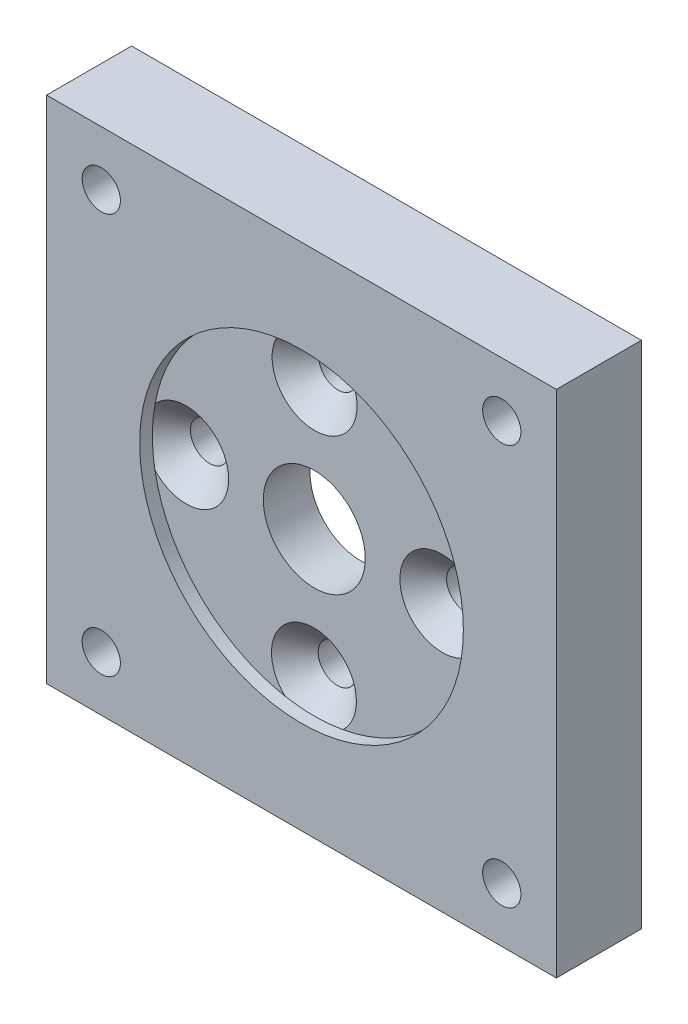
ISO-10303-21;
HEADER;
FILE_DESCRIPTION(('STEP AP214'),'2;1');
FILE_NAME('part.step','',(''),(''),'','','');
FILE_SCHEMA(('AUTOMOTIVE_DESIGN { 1 0 10303 214 1 1 1 1 }'));
ENDSEC;
DATA;
#1=APPLICATION_CONTEXT('core data for automotive mechanical design processes');
#2=APPLICATION_PROTOCOL_DEFINITION('international standard','automotive_design',2000,#1);
#3=PRODUCT_CONTEXT('',#1,'mechanical');
#4=PRODUCT('Part','Part','',(#3));
#5=PRODUCT_RELATED_PRODUCT_CATEGORY('part','',(#4));
#6=PRODUCT_DEFINITION_FORMATION('','',#4);
#7=PRODUCT_DEFINITION_CONTEXT('part definition',#1,'design');
#8=PRODUCT_DEFINITION('design','',#6,#7);
#9=PRODUCT_DEFINITION_SHAPE('','',#8);
#10=(LENGTH_UNIT() NAMED_UNIT(*) SI_UNIT(.MILLI.,.METRE.));
#11=(NAMED_UNIT(*) PLANE_ANGLE_UNIT() SI_UNIT($,.RADIAN.));
#12=(NAMED_UNIT(*) SI_UNIT($,.STERADIAN.) SOLID_ANGLE_UNIT());
#13=UNCERTAINTY_MEASURE_WITH_UNIT(LENGTH_MEASURE(1.E-05),#10,'distance_accuracy_value','');
#14=(GEOMETRIC_REPRESENTATION_CONTEXT(3) GLOBAL_UNCERTAINTY_ASSIGNED_CONTEXT((#13)) GLOBAL_UNIT_ASSIGNED_CONTEXT((#10,
#11,#12)) REPRESENTATION_CONTEXT('',''));
#15=CARTESIAN_POINT('',(0.,0.,0.));
#16=DIRECTION('',(0.,0.,1.));
#17=DIRECTION('',(1.,0.,0.));
#18=AXIS2_PLACEMENT_3D('',#15,#16,#17);
#19=CARTESIAN_POINT('',(0.,0.,0.));
#20=DIRECTION('',(0.,0.,1.));
#21=DIRECTION('',(1.,0.,0.));
#22=AXIS2_PLACEMENT_3D('',#19,#20,#21);
#23=CYLINDRICAL_SURFACE('',#22,6.);
#24=CARTESIAN_POINT('',(0.,0.,8.5));
#25=DIRECTION('',(0.,0.,1.));
#26=DIRECTION('',(1.,0.,0.));
#27=AXIS2_PLACEMENT_3D('',#24,#25,#26);
#28=CIRCLE('',#27,6.);
#29=CARTESIAN_POINT('',(6.,0.,8.5));
#30=VERTEX_POINT('',#29);
#31=EDGE_CURVE('E136',#30,#30,#28,.F.);
#32=ORIENTED_EDGE('',*,*,#31,.F.);
#33=EDGE_LOOP('',(#32));
#34=FACE_BOUND('',#33,.T.);
#35=CARTESIAN_POINT('',(0.,0.,3.));
#36=DIRECTION('',(0.,0.,-1.));
#37=DIRECTION('',(-1.,0.,0.));
#38=AXIS2_PLACEMENT_3D('',#35,#36,#37);
#39=CIRCLE('',#38,6.);
#40=CARTESIAN_POINT('',(-6.,0.,3.));
#41=VERTEX_POINT('',#40);
#42=EDGE_CURVE('E125',#41,#41,#39,.F.);
#43=ORIENTED_EDGE('',*,*,#42,.F.);
#44=EDGE_LOOP('',(#43));
#45=FACE_BOUND('',#44,.T.);
#46=ADVANCED_FACE('F38',(#34,#45),#23,.F.);
#47=CARTESIAN_POINT('',(-0.0375234668427253,-15.0751884434007,8.5));
#48=DIRECTION('',(0.,0.,1.));
#49=DIRECTION('',(1.,0.,0.));
#50=AXIS2_PLACEMENT_3D('',#47,#48,#49);
#51=CYLINDRICAL_SURFACE('',#50,2.24999999999999);
#52=CARTESIAN_POINT('',(-0.0375234668427253,-15.0751884434007,5.75));
#53=DIRECTION('',(0.,0.,1.));
#54=DIRECTION('',(1.,0.,0.));
#55=AXIS2_PLACEMENT_3D('',#52,#53,#54);
#56=CIRCLE('',#55,2.25);
#57=CARTESIAN_POINT('',(2.21247653315727,-15.0751884434007,5.75));
#58=VERTEX_POINT('',#57);
#59=EDGE_CURVE('E170',#58,#58,#56,.T.);
#60=ORIENTED_EDGE('',*,*,#59,.T.);
#61=EDGE_LOOP('',(#60));
#62=FACE_BOUND('',#61,.T.);
#63=CARTESIAN_POINT('',(-0.0375234668427253,-15.0751884434007,3.));
#64=DIRECTION('',(0.,0.,-1.));
#65=DIRECTION('',(-1.,0.,0.));
#66=AXIS2_PLACEMENT_3D('',#63,#64,#65);
#67=CIRCLE('',#66,2.24999999999999);
#68=CARTESIAN_POINT('',(-2.28752346684272,-15.0751884434007,3.));
#69=VERTEX_POINT('',#68);
#70=EDGE_CURVE('E368',#69,#69,#67,.F.);
#71=ORIENTED_EDGE('',*,*,#70,.F.);
#72=EDGE_LOOP('',(#71));
#73=FACE_BOUND('',#72,.T.);
#74=ADVANCED_FACE('F257',(#62,#73),#51,.F.);
#75=CARTESIAN_POINT('',(0.0375234668427323,15.0751884434007,8.5));
#76=DIRECTION('',(0.,0.,1.));
#77=DIRECTION('',(1.,0.,0.));
#78=AXIS2_PLACEMENT_3D('',#75,#76,#77);
#79=CYLINDRICAL_SURFACE('',#78,2.24999999999999);
#80=CARTESIAN_POINT('',(0.0375234668427323,15.0751884434007,5.75));
#81=DIRECTION('',(0.,0.,1.));
#82=DIRECTION('',(1.,0.,0.));
#83=AXIS2_PLACEMENT_3D('',#80,#81,#82);
#84=CIRCLE('',#83,2.25);
#85=CARTESIAN_POINT('',(2.28752346684273,15.0751884434007,5.75));
#86=VERTEX_POINT('',#85);
#87=EDGE_CURVE('E161',#86,#86,#84,.T.);
#88=ORIENTED_EDGE('',*,*,#87,.T.);
#89=EDGE_LOOP('',(#88));
#90=FACE_BOUND('',#89,.T.);
#91=CARTESIAN_POINT('',(0.0375234668427323,15.0751884434007,3.));
#92=DIRECTION('',(0.,0.,-1.));
#93=DIRECTION('',(-1.,0.,0.));
#94=AXIS2_PLACEMENT_3D('',#91,#92,#93);
#95=CIRCLE('',#94,2.24999999999999);
#96=CARTESIAN_POINT('',(-2.21247653315726,15.0751884434007,3.));
#97=VERTEX_POINT('',#96);
#98=EDGE_CURVE('E364',#97,#97,#95,.F.);
#99=ORIENTED_EDGE('',*,*,#98,.F.);
#100=EDGE_LOOP('',(#99));
#101=FACE_BOUND('',#100,.T.);
#102=ADVANCED_FACE('F263',(#90,#101),#79,.F.);
#103=CARTESIAN_POINT('',(15.0751884434007,-0.0375234668427288,8.5));
#104=DIRECTION('',(0.,0.,1.));
#105=DIRECTION('',(1.,0.,0.));
#106=AXIS2_PLACEMENT_3D('',#103,#104,#105);
#107=CYLINDRICAL_SURFACE('',#106,2.24999999999999);
#108=CARTESIAN_POINT('',(15.0751884434007,-0.0375234668427288,5.75));
#109=DIRECTION('',(0.,0.,1.));
#110=DIRECTION('',(1.,0.,0.));
#111=AXIS2_PLACEMENT_3D('',#108,#109,#110);
#112=CIRCLE('',#111,2.25);
#113=CARTESIAN_POINT('',(17.3251884434007,-0.0375234668427288,5.75));
#114=VERTEX_POINT('',#113);
#115=EDGE_CURVE('E158',#114,#114,#112,.T.);
#116=ORIENTED_EDGE('',*,*,#115,.T.);
#117=EDGE_LOOP('',(#116));
#118=FACE_BOUND('',#117,.T.);
#119=CARTESIAN_POINT('',(15.0751884434007,-0.0375234668427288,3.));
#120=DIRECTION('',(0.,0.,-1.));
#121=DIRECTION('',(-1.,0.,0.));
#122=AXIS2_PLACEMENT_3D('',#119,#120,#121);
#123=CIRCLE('',#122,2.24999999999999);
#124=CARTESIAN_POINT('',(12.8251884434007,-0.0375234668427288,3.));
#125=VERTEX_POINT('',#124);
#126=EDGE_CURVE('E360',#125,#125,#123,.F.);
#127=ORIENTED_EDGE('',*,*,#126,.F.);
#128=EDGE_LOOP('',(#127));
#129=FACE_BOUND('',#128,.T.);
#130=ADVANCED_FACE('F316',(#118,#129),#107,.F.);
#131=CARTESIAN_POINT('',(-15.0751884434007,0.0375234668427288,8.5));
#132=DIRECTION('',(0.,0.,1.));
#133=DIRECTION('',(1.,0.,0.));
#134=AXIS2_PLACEMENT_3D('',#131,#132,#133);
#135=CYLINDRICAL_SURFACE('',#134,2.24999999999999);
#136=CARTESIAN_POINT('',(-15.0751884434007,0.0375234668427288,5.75));
#137=DIRECTION('',(0.,0.,1.));
#138=DIRECTION('',(1.,0.,0.));
#139=AXIS2_PLACEMENT_3D('',#136,#137,#138);
#140=CIRCLE('',#139,2.25);
#141=CARTESIAN_POINT('',(-12.8251884434007,0.0375234668427288,5.75));
#142=VERTEX_POINT('',#141);
#143=EDGE_CURVE('E117',#142,#142,#140,.T.);
#144=ORIENTED_EDGE('',*,*,#143,.T.);
#145=EDGE_LOOP('',(#144));
#146=FACE_BOUND('',#145,.T.);
#147=CARTESIAN_POINT('',(-15.0751884434007,0.0375234668427288,3.));
#148=DIRECTION('',(0.,0.,-1.));
#149=DIRECTION('',(-1.,0.,0.));
#150=AXIS2_PLACEMENT_3D('',#147,#148,#149);
#151=CIRCLE('',#150,2.24999999999999);
#152=CARTESIAN_POINT('',(-17.3251884434007,0.0375234668427288,3.));
#153=VERTEX_POINT('',#152);
#154=EDGE_CURVE('E42',#153,#153,#151,.F.);
#155=ORIENTED_EDGE('',*,*,#154,.F.);
#156=EDGE_LOOP('',(#155));
#157=FACE_BOUND('',#156,.T.);
#158=ADVANCED_FACE('F328',(#146,#157),#135,.F.);
#159=CARTESIAN_POINT('',(30.,-30.,10.));
#160=DIRECTION('',(-1.,0.,0.));
#161=DIRECTION('',(0.,0.,1.));
#162=AXIS2_PLACEMENT_3D('',#159,#160,#161);
#163=PLANE('',#162);
#164=DIRECTION('',(0.,1.,0.));
#165=VECTOR('',#164,1.);
#166=CARTESIAN_POINT('',(30.,-30.,0.));
#167=LINE('',#166,#165);
#168=CARTESIAN_POINT('',(30.,-30.,0.));
#169=VERTEX_POINT('',#168);
#170=CARTESIAN_POINT('',(30.,30.,0.));
#171=VERTEX_POINT('',#170);
#172=EDGE_CURVE('E141',#169,#171,#167,.T.);
#173=ORIENTED_EDGE('',*,*,#172,.T.);
#174=DIRECTION('',(0.,0.,-1.));
#175=VECTOR('',#174,1.);
#176=CARTESIAN_POINT('',(30.,30.,10.));
#177=LINE('',#176,#175);
#178=CARTESIAN_POINT('',(30.,30.,10.));
#179=VERTEX_POINT('',#178);
#180=EDGE_CURVE('E11',#179,#171,#177,.T.);
#181=ORIENTED_EDGE('',*,*,#180,.F.);
#182=DIRECTION('',(0.,1.,0.));
#183=VECTOR('',#182,1.);
#184=CARTESIAN_POINT('',(30.,-30.,10.));
#185=LINE('',#184,#183);
#186=CARTESIAN_POINT('',(30.,-30.,10.));
#187=VERTEX_POINT('',#186);
#188=EDGE_CURVE('E209',#187,#179,#185,.T.);
#189=ORIENTED_EDGE('',*,*,#188,.F.);
#190=DIRECTION('',(0.,0.,-1.));
#191=VECTOR('',#190,1.);
#192=CARTESIAN_POINT('',(30.,-30.,10.));
#193=LINE('',#192,#191);
#194=EDGE_CURVE('E232',#187,#169,#193,.T.);
#195=ORIENTED_EDGE('',*,*,#194,.T.);
#196=EDGE_LOOP('',(#173,#181,#189,#195));
#197=FACE_BOUND('',#196,.T.);
#198=ADVANCED_FACE('F40',(#197),#163,.F.);
#199=CARTESIAN_POINT('',(-30.,30.,10.));
#200=DIRECTION('',(0.,-1.,0.));
#201=DIRECTION('',(0.,0.,-1.));
#202=AXIS2_PLACEMENT_3D('',#199,#200,#201);
#203=PLANE('',#202);
#204=DIRECTION('',(-1.,0.,0.));
#205=VECTOR('',#204,1.);
#206=CARTESIAN_POINT('',(-30.,30.,0.));
#207=LINE('',#206,#205);
#208=CARTESIAN_POINT('',(-30.,30.,0.));
#209=VERTEX_POINT('',#208);
#210=EDGE_CURVE('E224',#171,#209,#207,.T.);
#211=ORIENTED_EDGE('',*,*,#210,.T.);
#212=DIRECTION('',(0.,0.,-1.));
#213=VECTOR('',#212,1.);
#214=CARTESIAN_POINT('',(-30.,30.,10.));
#215=LINE('',#214,#213);
#216=CARTESIAN_POINT('',(-30.,30.,10.));
#217=VERTEX_POINT('',#216);
#218=EDGE_CURVE('E47',#217,#209,#215,.T.);
#219=ORIENTED_EDGE('',*,*,#218,.F.);
#220=DIRECTION('',(-1.,0.,0.));
#221=VECTOR('',#220,1.);
#222=CARTESIAN_POINT('',(-30.,30.,10.));
#223=LINE('',#222,#221);
#224=EDGE_CURVE('E211',#179,#217,#223,.T.);
#225=ORIENTED_EDGE('',*,*,#224,.F.);
#226=ORIENTED_EDGE('',*,*,#180,.T.);
#227=EDGE_LOOP('',(#211,#219,#225,#226));
#228=FACE_BOUND('',#227,.T.);
#229=ADVANCED_FACE('F223',(#228),#203,.F.);
#230=CARTESIAN_POINT('',(-30.,-30.,10.));
#231=DIRECTION('',(1.,0.,0.));
#232=DIRECTION('',(0.,0.,-1.));
#233=AXIS2_PLACEMENT_3D('',#230,#231,#232);
#234=PLANE('',#233);
#235=DIRECTION('',(0.,-1.,0.));
#236=VECTOR('',#235,1.);
#237=CARTESIAN_POINT('',(-30.,-30.,0.));
#238=LINE('',#237,#236);
#239=CARTESIAN_POINT('',(-30.,-30.,0.));
#240=VERTEX_POINT('',#239);
#241=EDGE_CURVE('E235',#209,#240,#238,.T.);
#242=ORIENTED_EDGE('',*,*,#241,.T.);
#243=DIRECTION('',(0.,0.,-1.));
#244=VECTOR('',#243,1.);
#245=CARTESIAN_POINT('',(-30.,-30.,10.));
#246=LINE('',#245,#244);
#247=CARTESIAN_POINT('',(-30.,-30.,10.));
#248=VERTEX_POINT('',#247);
#249=EDGE_CURVE('E239',#248,#240,#246,.T.);
#250=ORIENTED_EDGE('',*,*,#249,.F.);
#251=DIRECTION('',(0.,-1.,0.));
#252=VECTOR('',#251,1.);
#253=CARTESIAN_POINT('',(-30.,-30.,10.));
#254=LINE('',#253,#252);
#255=EDGE_CURVE('E227',#217,#248,#254,.T.);
#256=ORIENTED_EDGE('',*,*,#255,.F.);
#257=ORIENTED_EDGE('',*,*,#218,.T.);
#258=EDGE_LOOP('',(#242,#250,#256,#257));
#259=FACE_BOUND('',#258,.T.);
#260=ADVANCED_FACE('F244',(#259),#234,.F.);
#261=CARTESIAN_POINT('',(-30.,-30.,10.));
#262=DIRECTION('',(0.,1.,0.));
#263=DIRECTION('',(0.,0.,1.));
#264=AXIS2_PLACEMENT_3D('',#261,#262,#263);
#265=PLANE('',#264);
#266=DIRECTION('',(1.,0.,0.));
#267=VECTOR('',#266,1.);
#268=CARTESIAN_POINT('',(-30.,-30.,0.));
#269=LINE('',#268,#267);
#270=EDGE_CURVE('E218',#240,#169,#269,.T.);
#271=ORIENTED_EDGE('',*,*,#270,.T.);
#272=ORIENTED_EDGE('',*,*,#194,.F.);
#273=DIRECTION('',(1.,0.,0.));
#274=VECTOR('',#273,1.);
#275=CARTESIAN_POINT('',(-30.,-30.,10.));
#276=LINE('',#275,#274);
#277=EDGE_CURVE('E214',#248,#187,#276,.T.);
#278=ORIENTED_EDGE('',*,*,#277,.F.);
#279=ORIENTED_EDGE('',*,*,#249,.T.);
#280=EDGE_LOOP('',(#271,#272,#278,#279));
#281=FACE_BOUND('',#280,.T.);
#282=ADVANCED_FACE('F202',(#281),#265,.F.);
#283=CARTESIAN_POINT('',(0.,0.,10.));
#284=DIRECTION('',(0.,0.,-1.));
#285=DIRECTION('',(-1.,0.,0.));
#286=AXIS2_PLACEMENT_3D('',#283,#284,#285);
#287=PLANE('',#286);
#288=CARTESIAN_POINT('',(-23.57,-23.57,10.));
#289=DIRECTION('',(0.,0.,1.));
#290=DIRECTION('',(1.,0.,0.));
#291=AXIS2_PLACEMENT_3D('',#288,#289,#290);
#292=CIRCLE('',#291,2.25);
#293=CARTESIAN_POINT('',(-21.32,-23.57,10.));
#294=VERTEX_POINT('',#293);
#295=EDGE_CURVE('E173',#294,#294,#292,.T.);
#296=ORIENTED_EDGE('',*,*,#295,.F.);
#297=EDGE_LOOP('',(#296));
#298=FACE_BOUND('',#297,.T.);
#299=CARTESIAN_POINT('',(23.57,-23.57,10.));
#300=DIRECTION('',(0.,0.,1.));
#301=DIRECTION('',(1.,0.,0.));
#302=AXIS2_PLACEMENT_3D('',#299,#300,#301);
#303=CIRCLE('',#302,2.25);
#304=CARTESIAN_POINT('',(25.82,-23.57,10.));
#305=VERTEX_POINT('',#304);
#306=EDGE_CURVE('E184',#305,#305,#303,.T.);
#307=ORIENTED_EDGE('',*,*,#306,.F.);
#308=EDGE_LOOP('',(#307));
#309=FACE_BOUND('',#308,.T.);
#310=CARTESIAN_POINT('',(23.57,23.57,10.));
#311=DIRECTION('',(0.,0.,1.));
#312=DIRECTION('',(1.,0.,0.));
#313=AXIS2_PLACEMENT_3D('',#310,#311,#312);
#314=CIRCLE('',#313,2.25);
#315=CARTESIAN_POINT('',(25.82,23.57,10.));
#316=VERTEX_POINT('',#315);
#317=EDGE_CURVE('E178',#316,#316,#314,.T.);
#318=ORIENTED_EDGE('',*,*,#317,.F.);
#319=EDGE_LOOP('',(#318));
#320=FACE_BOUND('',#319,.T.);
#321=CARTESIAN_POINT('',(-23.57,23.57,10.));
#322=DIRECTION('',(0.,0.,1.));
#323=DIRECTION('',(1.,0.,0.));
#324=AXIS2_PLACEMENT_3D('',#321,#322,#323);
#325=CIRCLE('',#324,2.25);
#326=CARTESIAN_POINT('',(-21.32,23.57,10.));
#327=VERTEX_POINT('',#326);
#328=EDGE_CURVE('E177',#327,#327,#325,.T.);
#329=ORIENTED_EDGE('',*,*,#328,.F.);
#330=EDGE_LOOP('',(#329));
#331=FACE_BOUND('',#330,.T.);
#332=CARTESIAN_POINT('',(0.,0.,10.));
#333=DIRECTION('',(0.,0.,1.));
#334=DIRECTION('',(1.,0.,0.));
#335=AXIS2_PLACEMENT_3D('',#332,#333,#334);
#336=CIRCLE('',#335,19.05);
#337=CARTESIAN_POINT('',(19.05,0.,10.));
#338=VERTEX_POINT('',#337);
#339=EDGE_CURVE('E131',#338,#338,#336,.T.);
#340=ORIENTED_EDGE('',*,*,#339,.F.);
#341=EDGE_LOOP('',(#340));
#342=FACE_BOUND('',#341,.T.);
#343=ORIENTED_EDGE('',*,*,#188,.T.);
#344=ORIENTED_EDGE('',*,*,#224,.T.);
#345=ORIENTED_EDGE('',*,*,#255,.T.);
#346=ORIENTED_EDGE('',*,*,#277,.T.);
#347=EDGE_LOOP('',(#343,#344,#345,#346));
#348=FACE_BOUND('',#347,.T.);
#349=ADVANCED_FACE('F198',(#298,#309,#320,#331,#342,#348),#287,.F.);
#350=CARTESIAN_POINT('',(0.,0.,0.));
#351=DIRECTION('',(0.,0.,-1.));
#352=DIRECTION('',(-1.,0.,0.));
#353=AXIS2_PLACEMENT_3D('',#350,#351,#352);
#354=PLANE('',#353);
#355=CARTESIAN_POINT('',(0.,0.,0.));
#356=DIRECTION('',(0.,0.,-1.));
#357=DIRECTION('',(-1.,0.,0.));
#358=AXIS2_PLACEMENT_3D('',#355,#356,#357);
#359=CIRCLE('',#358,22.4);
#360=CARTESIAN_POINT('',(-22.4,0.,0.));
#361=VERTEX_POINT('',#360);
#362=EDGE_CURVE('E278',#361,#361,#359,.T.);
#363=ORIENTED_EDGE('',*,*,#362,.F.);
#364=EDGE_LOOP('',(#363));
#365=FACE_BOUND('',#364,.T.);
#366=CARTESIAN_POINT('',(-23.57,-23.57,0.));
#367=DIRECTION('',(0.,0.,1.));
#368=DIRECTION('',(1.,0.,0.));
#369=AXIS2_PLACEMENT_3D('',#366,#367,#368);
#370=CIRCLE('',#369,2.25);
#371=CARTESIAN_POINT('',(-21.32,-23.57,0.));
#372=VERTEX_POINT('',#371);
#373=EDGE_CURVE('E187',#372,#372,#370,.T.);
#374=ORIENTED_EDGE('',*,*,#373,.T.);
#375=EDGE_LOOP('',(#374));
#376=FACE_BOUND('',#375,.T.);
#377=CARTESIAN_POINT('',(23.57,-23.57,0.));
#378=DIRECTION('',(0.,0.,1.));
#379=DIRECTION('',(1.,0.,0.));
#380=AXIS2_PLACEMENT_3D('',#377,#378,#379);
#381=CIRCLE('',#380,2.25);
#382=CARTESIAN_POINT('',(25.82,-23.57,0.));
#383=VERTEX_POINT('',#382);
#384=EDGE_CURVE('E181',#383,#383,#381,.T.);
#385=ORIENTED_EDGE('',*,*,#384,.T.);
#386=EDGE_LOOP('',(#385));
#387=FACE_BOUND('',#386,.T.);
#388=CARTESIAN_POINT('',(23.57,23.57,0.));
#389=DIRECTION('',(0.,0.,1.));
#390=DIRECTION('',(1.,0.,0.));
#391=AXIS2_PLACEMENT_3D('',#388,#389,#390);
#392=CIRCLE('',#391,2.25);
#393=CARTESIAN_POINT('',(25.82,23.57,0.));
#394=VERTEX_POINT('',#393);
#395=EDGE_CURVE('E174',#394,#394,#392,.T.);
#396=ORIENTED_EDGE('',*,*,#395,.T.);
#397=EDGE_LOOP('',(#396));
#398=FACE_BOUND('',#397,.T.);
#399=CARTESIAN_POINT('',(-23.57,23.57,0.));
#400=DIRECTION('',(0.,0.,1.));
#401=DIRECTION('',(1.,0.,0.));
#402=AXIS2_PLACEMENT_3D('',#399,#400,#401);
#403=CIRCLE('',#402,2.25);
#404=CARTESIAN_POINT('',(-21.32,23.57,0.));
#405=VERTEX_POINT('',#404);
#406=EDGE_CURVE('E133',#405,#405,#403,.T.);
#407=ORIENTED_EDGE('',*,*,#406,.T.);
#408=EDGE_LOOP('',(#407));
#409=FACE_BOUND('',#408,.T.);
#410=ORIENTED_EDGE('',*,*,#172,.F.);
#411=ORIENTED_EDGE('',*,*,#270,.F.);
#412=ORIENTED_EDGE('',*,*,#241,.F.);
#413=ORIENTED_EDGE('',*,*,#210,.F.);
#414=EDGE_LOOP('',(#410,#411,#412,#413));
#415=FACE_BOUND('',#414,.T.);
#416=ADVANCED_FACE('F201',(#365,#376,#387,#398,#409,#415),#354,.T.);
#417=CARTESIAN_POINT('',(0.,0.,8.5));
#418=DIRECTION('',(0.,0.,1.));
#419=DIRECTION('',(1.,0.,0.));
#420=AXIS2_PLACEMENT_3D('',#417,#418,#419);
#421=PLANE('',#420);
#422=CARTESIAN_POINT('',(-15.0751884434007,0.0375234668427288,8.5));
#423=DIRECTION('',(0.,0.,1.));
#424=DIRECTION('',(1.,0.,0.));
#425=AXIS2_PLACEMENT_3D('',#422,#423,#424);
#426=CIRCLE('',#425,5.);
#427=CARTESIAN_POINT('',(-18.7532178567345,-3.34952534217254,8.5));
#428=VERTEX_POINT('',#427);
#429=CARTESIAN_POINT('',(-18.7363110632136,3.44284006925965,8.5));
#430=VERTEX_POINT('',#429);
#431=EDGE_CURVE('E116',#428,#430,#426,.T.);
#432=ORIENTED_EDGE('',*,*,#431,.F.);
#433=CARTESIAN_POINT('',(0.,0.,8.5));
#434=DIRECTION('',(0.,0.,1.));
#435=DIRECTION('',(1.,0.,0.));
#436=AXIS2_PLACEMENT_3D('',#433,#434,#435);
#437=CIRCLE('',#436,19.05);
#438=CARTESIAN_POINT('',(-3.44284006925928,-18.7363110632137,8.5));
#439=VERTEX_POINT('',#438);
#440=EDGE_CURVE('E110',#428,#439,#437,.T.);
#441=ORIENTED_EDGE('',*,*,#440,.T.);
#442=CARTESIAN_POINT('',(-0.0375234668427253,-15.0751884434007,8.5));
#443=DIRECTION('',(0.,0.,1.));
#444=DIRECTION('',(1.,0.,0.));
#445=AXIS2_PLACEMENT_3D('',#442,#443,#444);
#446=CIRCLE('',#445,5.);
#447=CARTESIAN_POINT('',(3.34952534217254,-18.7532178567345,8.5));
#448=VERTEX_POINT('',#447);
#449=EDGE_CURVE('E163',#448,#439,#446,.T.);
#450=ORIENTED_EDGE('',*,*,#449,.F.);
#451=CARTESIAN_POINT('',(18.7363110632137,-3.44284006925929,8.5));
#452=VERTEX_POINT('',#451);
#453=EDGE_CURVE('E137',#448,#452,#437,.T.);
#454=ORIENTED_EDGE('',*,*,#453,.T.);
#455=CARTESIAN_POINT('',(15.0751884434007,-0.0375234668427288,8.5));
#456=DIRECTION('',(0.,0.,1.));
#457=DIRECTION('',(1.,0.,0.));
#458=AXIS2_PLACEMENT_3D('',#455,#456,#457);
#459=CIRCLE('',#458,5.);
#460=CARTESIAN_POINT('',(18.7532178567344,3.34952534217275,8.5));
#461=VERTEX_POINT('',#460);
#462=EDGE_CURVE('E153',#461,#452,#459,.T.);
#463=ORIENTED_EDGE('',*,*,#462,.F.);
#464=CARTESIAN_POINT('',(3.44284006925929,18.7363110632137,8.5));
#465=VERTEX_POINT('',#464);
#466=EDGE_CURVE('E112',#461,#465,#437,.T.);
#467=ORIENTED_EDGE('',*,*,#466,.T.);
#468=CARTESIAN_POINT('',(0.0375234668427323,15.0751884434007,8.5));
#469=DIRECTION('',(0.,0.,1.));
#470=DIRECTION('',(1.,0.,0.));
#471=AXIS2_PLACEMENT_3D('',#468,#469,#470);
#472=CIRCLE('',#471,5.);
#473=CARTESIAN_POINT('',(-3.34952534217256,18.7532178567345,8.5));
#474=VERTEX_POINT('',#473);
#475=EDGE_CURVE('E152',#474,#465,#472,.T.);
#476=ORIENTED_EDGE('',*,*,#475,.F.);
#477=EDGE_CURVE('E109',#474,#430,#437,.T.);
#478=ORIENTED_EDGE('',*,*,#477,.T.);
#479=EDGE_LOOP('',(#432,#441,#450,#454,#463,#467,#476,#478));
#480=FACE_BOUND('',#479,.T.);
#481=ORIENTED_EDGE('',*,*,#31,.T.);
#482=EDGE_LOOP('',(#481));
#483=FACE_BOUND('',#482,.T.);
#484=ADVANCED_FACE('F120',(#480,#483),#421,.T.);
#485=CARTESIAN_POINT('',(0.,0.,8.5));
#486=DIRECTION('',(0.,0.,1.));
#487=DIRECTION('',(1.,0.,0.));
#488=AXIS2_PLACEMENT_3D('',#485,#486,#487);
#489=CYLINDRICAL_SURFACE('',#488,19.05);
#490=EDGE_CURVE('E130',#439,#448,#437,.T.);
#491=ORIENTED_EDGE('',*,*,#490,.F.);
#492=ORIENTED_EDGE('',*,*,#440,.F.);
#493=EDGE_CURVE('E103',#430,#428,#437,.T.);
#494=ORIENTED_EDGE('',*,*,#493,.F.);
#495=ORIENTED_EDGE('',*,*,#477,.F.);
#496=EDGE_CURVE('E144',#465,#474,#437,.T.);
#497=ORIENTED_EDGE('',*,*,#496,.F.);
#498=ORIENTED_EDGE('',*,*,#466,.F.);
#499=EDGE_CURVE('E143',#452,#461,#437,.T.);
#500=ORIENTED_EDGE('',*,*,#499,.F.);
#501=ORIENTED_EDGE('',*,*,#453,.F.);
#502=EDGE_LOOP('',(#491,#492,#494,#495,#497,#498,#500,#501));
#503=FACE_BOUND('',#502,.T.);
#504=ORIENTED_EDGE('',*,*,#339,.T.);
#505=EDGE_LOOP('',(#504));
#506=FACE_BOUND('',#505,.T.);
#507=ADVANCED_FACE('F127',(#503,#506),#489,.F.);
#508=CARTESIAN_POINT('',(-23.57,23.57,0.));
#509=DIRECTION('',(0.,0.,1.));
#510=DIRECTION('',(1.,0.,0.));
#511=AXIS2_PLACEMENT_3D('',#508,#509,#510);
#512=CYLINDRICAL_SURFACE('',#511,2.25);
#513=ORIENTED_EDGE('',*,*,#406,.F.);
#514=EDGE_LOOP('',(#513));
#515=FACE_BOUND('',#514,.T.);
#516=ORIENTED_EDGE('',*,*,#328,.T.);
#517=EDGE_LOOP('',(#516));
#518=FACE_BOUND('',#517,.T.);
#519=ADVANCED_FACE('F196',(#515,#518),#512,.F.);
#520=CARTESIAN_POINT('',(23.57,23.57,0.));
#521=DIRECTION('',(0.,0.,1.));
#522=DIRECTION('',(1.,0.,0.));
#523=AXIS2_PLACEMENT_3D('',#520,#521,#522);
#524=CYLINDRICAL_SURFACE('',#523,2.25);
#525=ORIENTED_EDGE('',*,*,#395,.F.);
#526=EDGE_LOOP('',(#525));
#527=FACE_BOUND('',#526,.T.);
#528=ORIENTED_EDGE('',*,*,#317,.T.);
#529=EDGE_LOOP('',(#528));
#530=FACE_BOUND('',#529,.T.);
#531=ADVANCED_FACE('F288',(#527,#530),#524,.F.);
#532=CARTESIAN_POINT('',(23.57,-23.57,0.));
#533=DIRECTION('',(0.,0.,1.));
#534=DIRECTION('',(1.,0.,0.));
#535=AXIS2_PLACEMENT_3D('',#532,#533,#534);
#536=CYLINDRICAL_SURFACE('',#535,2.25);
#537=ORIENTED_EDGE('',*,*,#384,.F.);
#538=EDGE_LOOP('',(#537));
#539=FACE_BOUND('',#538,.T.);
#540=ORIENTED_EDGE('',*,*,#306,.T.);
#541=EDGE_LOOP('',(#540));
#542=FACE_BOUND('',#541,.T.);
#543=ADVANCED_FACE('F294',(#539,#542),#536,.F.);
#544=CARTESIAN_POINT('',(-23.57,-23.57,0.));
#545=DIRECTION('',(0.,0.,1.));
#546=DIRECTION('',(1.,0.,0.));
#547=AXIS2_PLACEMENT_3D('',#544,#545,#546);
#548=CYLINDRICAL_SURFACE('',#547,2.25);
#549=ORIENTED_EDGE('',*,*,#373,.F.);
#550=EDGE_LOOP('',(#549));
#551=FACE_BOUND('',#550,.T.);
#552=ORIENTED_EDGE('',*,*,#295,.T.);
#553=EDGE_LOOP('',(#552));
#554=FACE_BOUND('',#553,.T.);
#555=ADVANCED_FACE('F298',(#551,#554),#548,.F.);
#556=CARTESIAN_POINT('',(4.96247653315727,-15.0751884434007,8.5));
#557=DIRECTION('',(0.,0.,1.));
#558=DIRECTION('',(1.,0.,0.));
#559=AXIS2_PLACEMENT_3D('',#556,#557,#558);
#560=PLANE('',#559);
#561=EDGE_CURVE('E168',#439,#448,#446,.T.);
#562=ORIENTED_EDGE('',*,*,#561,.F.);
#563=ORIENTED_EDGE('',*,*,#490,.T.);
#564=EDGE_LOOP('',(#562,#563));
#565=FACE_BOUND('',#564,.T.);
#566=ADVANCED_FACE('F301',(#565),#560,.F.);
#567=CARTESIAN_POINT('',(-0.0375234668427253,-15.0751884434007,8.5));
#568=DIRECTION('',(0.,0.,1.));
#569=DIRECTION('',(1.,0.,0.));
#570=AXIS2_PLACEMENT_3D('',#567,#568,#569);
#571=CONICAL_SURFACE('',#570,5.,0.785398163397449);
#572=ORIENTED_EDGE('',*,*,#59,.F.);
#573=EDGE_LOOP('',(#572));
#574=FACE_BOUND('',#573,.T.);
#575=ORIENTED_EDGE('',*,*,#561,.T.);
#576=ORIENTED_EDGE('',*,*,#449,.T.);
#577=EDGE_LOOP('',(#575,#576));
#578=FACE_BOUND('',#577,.T.);
#579=ADVANCED_FACE('F307',(#574,#578),#571,.F.);
#580=CARTESIAN_POINT('',(5.03752346684273,15.0751884434007,8.5));
#581=DIRECTION('',(0.,0.,1.));
#582=DIRECTION('',(1.,0.,0.));
#583=AXIS2_PLACEMENT_3D('',#580,#581,#582);
#584=PLANE('',#583);
#585=EDGE_CURVE('E157',#465,#474,#472,.T.);
#586=ORIENTED_EDGE('',*,*,#585,.F.);
#587=ORIENTED_EDGE('',*,*,#496,.T.);
#588=EDGE_LOOP('',(#586,#587));
#589=FACE_BOUND('',#588,.T.);
#590=ADVANCED_FACE('F160',(#589),#584,.F.);
#591=CARTESIAN_POINT('',(0.0375234668427323,15.0751884434007,8.5));
#592=DIRECTION('',(0.,0.,1.));
#593=DIRECTION('',(1.,0.,0.));
#594=AXIS2_PLACEMENT_3D('',#591,#592,#593);
#595=CONICAL_SURFACE('',#594,5.,0.785398163397449);
#596=ORIENTED_EDGE('',*,*,#87,.F.);
#597=EDGE_LOOP('',(#596));
#598=FACE_BOUND('',#597,.T.);
#599=ORIENTED_EDGE('',*,*,#585,.T.);
#600=ORIENTED_EDGE('',*,*,#475,.T.);
#601=EDGE_LOOP('',(#599,#600));
#602=FACE_BOUND('',#601,.T.);
#603=ADVANCED_FACE('F156',(#598,#602),#595,.F.);
#604=CARTESIAN_POINT('',(20.0751884434007,-0.0375234668427288,8.5));
#605=DIRECTION('',(0.,0.,1.));
#606=DIRECTION('',(1.,0.,0.));
#607=AXIS2_PLACEMENT_3D('',#604,#605,#606);
#608=PLANE('',#607);
#609=EDGE_CURVE('E61',#452,#461,#459,.T.);
#610=ORIENTED_EDGE('',*,*,#609,.F.);
#611=ORIENTED_EDGE('',*,*,#499,.T.);
#612=EDGE_LOOP('',(#610,#611));
#613=FACE_BOUND('',#612,.T.);
#614=ADVANCED_FACE('F320',(#613),#608,.F.);
#615=CARTESIAN_POINT('',(15.0751884434007,-0.0375234668427288,8.5));
#616=DIRECTION('',(0.,0.,1.));
#617=DIRECTION('',(1.,0.,0.));
#618=AXIS2_PLACEMENT_3D('',#615,#616,#617);
#619=CONICAL_SURFACE('',#618,5.,0.785398163397449);
#620=ORIENTED_EDGE('',*,*,#115,.F.);
#621=EDGE_LOOP('',(#620));
#622=FACE_BOUND('',#621,.T.);
#623=ORIENTED_EDGE('',*,*,#462,.T.);
#624=ORIENTED_EDGE('',*,*,#609,.T.);
#625=EDGE_LOOP('',(#623,#624));
#626=FACE_BOUND('',#625,.T.);
#627=ADVANCED_FACE('F324',(#622,#626),#619,.F.);
#628=CARTESIAN_POINT('',(-10.0751884434007,0.0375234668427288,8.5));
#629=DIRECTION('',(0.,0.,1.));
#630=DIRECTION('',(1.,0.,0.));
#631=AXIS2_PLACEMENT_3D('',#628,#629,#630);
#632=PLANE('',#631);
#633=EDGE_CURVE('E54',#430,#428,#426,.T.);
#634=ORIENTED_EDGE('',*,*,#633,.F.);
#635=ORIENTED_EDGE('',*,*,#493,.T.);
#636=EDGE_LOOP('',(#634,#635));
#637=FACE_BOUND('',#636,.T.);
#638=ADVANCED_FACE('F104',(#637),#632,.F.);
#639=CARTESIAN_POINT('',(-15.0751884434007,0.0375234668427288,8.5));
#640=DIRECTION('',(0.,0.,1.));
#641=DIRECTION('',(1.,0.,0.));
#642=AXIS2_PLACEMENT_3D('',#639,#640,#641);
#643=CONICAL_SURFACE('',#642,5.,0.785398163397448);
#644=ORIENTED_EDGE('',*,*,#143,.F.);
#645=EDGE_LOOP('',(#644));
#646=FACE_BOUND('',#645,.T.);
#647=ORIENTED_EDGE('',*,*,#633,.T.);
#648=ORIENTED_EDGE('',*,*,#431,.T.);
#649=EDGE_LOOP('',(#647,#648));
#650=FACE_BOUND('',#649,.T.);
#651=ADVANCED_FACE('F115',(#646,#650),#643,.F.);
#652=CARTESIAN_POINT('',(0.,0.,3.));
#653=DIRECTION('',(0.,0.,-1.));
#654=DIRECTION('',(-1.,0.,0.));
#655=AXIS2_PLACEMENT_3D('',#652,#653,#654);
#656=PLANE('',#655);
#657=CARTESIAN_POINT('',(0.,0.,3.));
#658=DIRECTION('',(0.,0.,-1.));
#659=DIRECTION('',(-1.,0.,0.));
#660=AXIS2_PLACEMENT_3D('',#657,#658,#659);
#661=CIRCLE('',#660,22.4);
#662=CARTESIAN_POINT('',(-22.4,0.,3.));
#663=VERTEX_POINT('',#662);
#664=EDGE_CURVE('E353',#663,#663,#661,.T.);
#665=ORIENTED_EDGE('',*,*,#664,.T.);
#666=EDGE_LOOP('',(#665));
#667=FACE_BOUND('',#666,.T.);
#668=ORIENTED_EDGE('',*,*,#154,.T.);
#669=EDGE_LOOP('',(#668));
#670=FACE_BOUND('',#669,.T.);
#671=ORIENTED_EDGE('',*,*,#126,.T.);
#672=EDGE_LOOP('',(#671));
#673=FACE_BOUND('',#672,.T.);
#674=ORIENTED_EDGE('',*,*,#98,.T.);
#675=EDGE_LOOP('',(#674));
#676=FACE_BOUND('',#675,.T.);
#677=ORIENTED_EDGE('',*,*,#70,.T.);
#678=EDGE_LOOP('',(#677));
#679=FACE_BOUND('',#678,.T.);
#680=ORIENTED_EDGE('',*,*,#42,.T.);
#681=EDGE_LOOP('',(#680));
#682=FACE_BOUND('',#681,.T.);
#683=ADVANCED_FACE('F340',(#667,#670,#673,#676,#679,#682),#656,.T.);
#684=CARTESIAN_POINT('',(0.,0.,3.));
#685=DIRECTION('',(0.,0.,-1.));
#686=DIRECTION('',(-1.,0.,0.));
#687=AXIS2_PLACEMENT_3D('',#684,#685,#686);
#688=CYLINDRICAL_SURFACE('',#687,22.4);
#689=ORIENTED_EDGE('',*,*,#664,.F.);
#690=EDGE_LOOP('',(#689));
#691=FACE_BOUND('',#690,.T.);
#692=ORIENTED_EDGE('',*,*,#362,.T.);
#693=EDGE_LOOP('',(#692));
#694=FACE_BOUND('',#693,.T.);
#695=ADVANCED_FACE('F342',(#691,#694),#688,.F.);
#696=CLOSED_SHELL('',(#46,#74,#102,#130,#158,#198,#229,#260,#282,#349,#416,#484,#507,#519,#531,
#543,#555,#566,#579,#590,#603,#614,#627,#638,#651,#683,#695));
#697=MANIFOLD_SOLID_BREP('B2',#696);
#698=ADVANCED_BREP_SHAPE_REPRESENTATION('',(#18,#697),#14);
#699=SHAPE_DEFINITION_REPRESENTATION(#9,#698);
ENDSEC;
END-ISO-10303-21;
